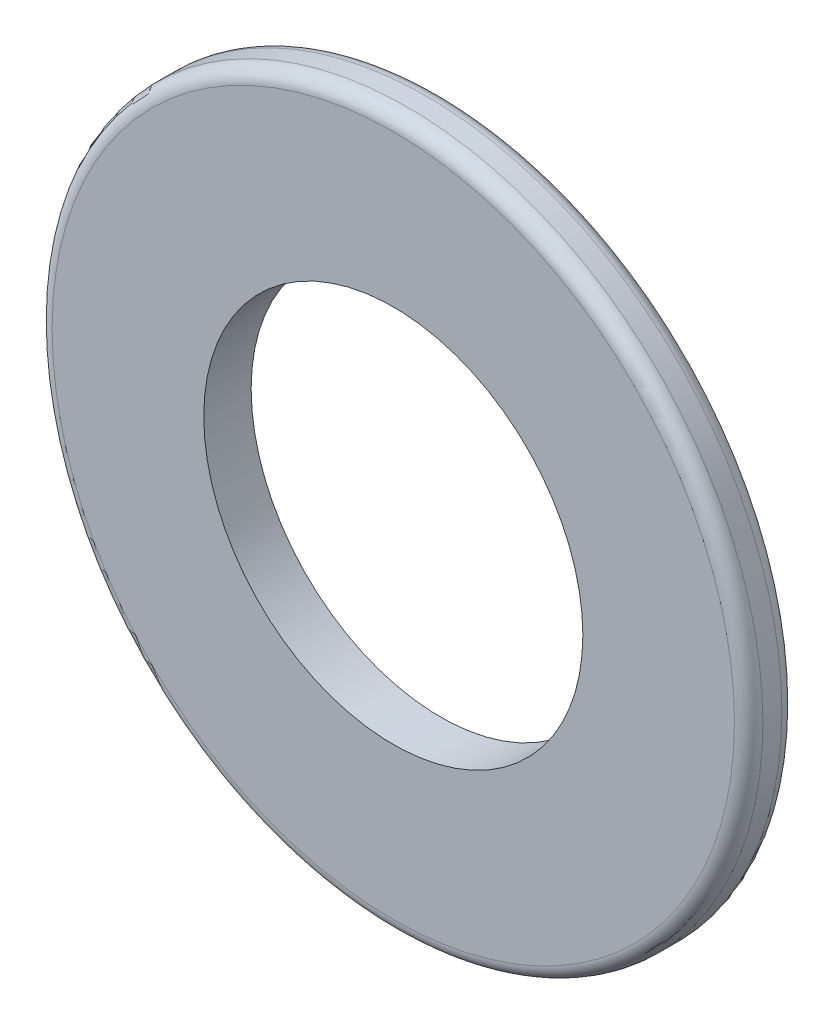
ISO-10303-21;
HEADER;
FILE_DESCRIPTION(('STEP AP214'),'2;1');
FILE_NAME('part.step','',(''),(''),'','','');
FILE_SCHEMA(('AUTOMOTIVE_DESIGN { 1 0 10303 214 1 1 1 1 }'));
ENDSEC;
DATA;
#1=APPLICATION_CONTEXT('core data for automotive mechanical design processes');
#2=APPLICATION_PROTOCOL_DEFINITION('international standard','automotive_design',2000,#1);
#3=PRODUCT_CONTEXT('',#1,'mechanical');
#4=PRODUCT('Part','Part','',(#3));
#5=PRODUCT_RELATED_PRODUCT_CATEGORY('part','',(#4));
#6=PRODUCT_DEFINITION_FORMATION('','',#4);
#7=PRODUCT_DEFINITION_CONTEXT('part definition',#1,'design');
#8=PRODUCT_DEFINITION('design','',#6,#7);
#9=PRODUCT_DEFINITION_SHAPE('','',#8);
#10=(LENGTH_UNIT() NAMED_UNIT(*) SI_UNIT(.MILLI.,.METRE.));
#11=(NAMED_UNIT(*) PLANE_ANGLE_UNIT() SI_UNIT($,.RADIAN.));
#12=(NAMED_UNIT(*) SI_UNIT($,.STERADIAN.) SOLID_ANGLE_UNIT());
#13=UNCERTAINTY_MEASURE_WITH_UNIT(LENGTH_MEASURE(1.E-05),#10,'distance_accuracy_value','');
#14=(GEOMETRIC_REPRESENTATION_CONTEXT(3) GLOBAL_UNCERTAINTY_ASSIGNED_CONTEXT((#13)) GLOBAL_UNIT_ASSIGNED_CONTEXT((#10,
#11,#12)) REPRESENTATION_CONTEXT('',''));
#15=CARTESIAN_POINT('',(0.,0.,0.));
#16=DIRECTION('',(0.,0.,1.));
#17=DIRECTION('',(1.,0.,0.));
#18=AXIS2_PLACEMENT_3D('',#15,#16,#17);
#19=CARTESIAN_POINT('',(0.,0.,1.));
#20=DIRECTION('',(0.,0.,1.));
#21=DIRECTION('',(1.,0.,0.));
#22=AXIS2_PLACEMENT_3D('',#19,#20,#21);
#23=PLANE('',#22);
#24=CARTESIAN_POINT('',(0.,0.,1.));
#25=DIRECTION('',(0.,0.,1.));
#26=DIRECTION('',(1.,0.,0.));
#27=AXIS2_PLACEMENT_3D('',#24,#25,#26);
#28=CIRCLE('',#27,7.2);
#29=CARTESIAN_POINT('',(7.2,0.,1.));
#30=VERTEX_POINT('',#29);
#31=EDGE_CURVE('E38',#30,#30,#28,.T.);
#32=ORIENTED_EDGE('',*,*,#31,.T.);
#33=EDGE_LOOP('',(#32));
#34=FACE_BOUND('',#33,.T.);
#35=CARTESIAN_POINT('',(0.,0.,1.));
#36=DIRECTION('',(0.,0.,1.));
#37=DIRECTION('',(1.,0.,0.));
#38=AXIS2_PLACEMENT_3D('',#35,#36,#37);
#39=CIRCLE('',#38,4.);
#40=CARTESIAN_POINT('',(4.,0.,1.));
#41=VERTEX_POINT('',#40);
#42=EDGE_CURVE('E51',#41,#41,#39,.T.);
#43=ORIENTED_EDGE('',*,*,#42,.F.);
#44=EDGE_LOOP('',(#43));
#45=FACE_BOUND('',#44,.T.);
#46=ADVANCED_FACE('F31',(#34,#45),#23,.T.);
#47=CARTESIAN_POINT('',(0.,0.,0.));
#48=DIRECTION('',(0.,0.,1.));
#49=DIRECTION('',(1.,0.,0.));
#50=AXIS2_PLACEMENT_3D('',#47,#48,#49);
#51=PLANE('',#50);
#52=CARTESIAN_POINT('',(0.,0.,0.));
#53=DIRECTION('',(0.,0.,1.));
#54=DIRECTION('',(1.,0.,0.));
#55=AXIS2_PLACEMENT_3D('',#52,#53,#54);
#56=CIRCLE('',#55,7.2);
#57=CARTESIAN_POINT('',(7.2,0.,0.));
#58=VERTEX_POINT('',#57);
#59=EDGE_CURVE('E42',#58,#58,#56,.F.);
#60=ORIENTED_EDGE('',*,*,#59,.T.);
#61=EDGE_LOOP('',(#60));
#62=FACE_BOUND('',#61,.T.);
#63=CARTESIAN_POINT('',(0.,0.,0.));
#64=DIRECTION('',(0.,0.,1.));
#65=DIRECTION('',(1.,0.,0.));
#66=AXIS2_PLACEMENT_3D('',#63,#64,#65);
#67=CIRCLE('',#66,4.);
#68=CARTESIAN_POINT('',(4.,0.,0.));
#69=VERTEX_POINT('',#68);
#70=EDGE_CURVE('E52',#69,#69,#67,.T.);
#71=ORIENTED_EDGE('',*,*,#70,.T.);
#72=EDGE_LOOP('',(#71));
#73=FACE_BOUND('',#72,.T.);
#74=ADVANCED_FACE('F62',(#62,#73),#51,.F.);
#75=CARTESIAN_POINT('',(0.,0.,1.));
#76=DIRECTION('',(0.,0.,-1.));
#77=DIRECTION('',(-1.,0.,0.));
#78=AXIS2_PLACEMENT_3D('',#75,#76,#77);
#79=CYLINDRICAL_SURFACE('',#78,7.5);
#80=CARTESIAN_POINT('',(0.,0.,0.7));
#81=DIRECTION('',(0.,0.,1.));
#82=DIRECTION('',(1.,0.,0.));
#83=AXIS2_PLACEMENT_3D('',#80,#81,#82);
#84=CIRCLE('',#83,7.5);
#85=CARTESIAN_POINT('',(7.5,0.,0.7));
#86=VERTEX_POINT('',#85);
#87=EDGE_CURVE('E10',#86,#86,#84,.F.);
#88=ORIENTED_EDGE('',*,*,#87,.T.);
#89=EDGE_LOOP('',(#88));
#90=FACE_BOUND('',#89,.T.);
#91=CARTESIAN_POINT('',(0.,0.,0.3));
#92=DIRECTION('',(0.,0.,1.));
#93=DIRECTION('',(1.,0.,0.));
#94=AXIS2_PLACEMENT_3D('',#91,#92,#93);
#95=CIRCLE('',#94,7.5);
#96=CARTESIAN_POINT('',(7.5,0.,0.3));
#97=VERTEX_POINT('',#96);
#98=EDGE_CURVE('E46',#97,#97,#95,.T.);
#99=ORIENTED_EDGE('',*,*,#98,.T.);
#100=EDGE_LOOP('',(#99));
#101=FACE_BOUND('',#100,.T.);
#102=ADVANCED_FACE('F67',(#90,#101),#79,.T.);
#103=CARTESIAN_POINT('',(0.,0.,1.));
#104=DIRECTION('',(0.,0.,-1.));
#105=DIRECTION('',(-1.,0.,0.));
#106=AXIS2_PLACEMENT_3D('',#103,#104,#105);
#107=CYLINDRICAL_SURFACE('',#106,4.);
#108=ORIENTED_EDGE('',*,*,#42,.T.);
#109=EDGE_LOOP('',(#108));
#110=FACE_BOUND('',#109,.T.);
#111=ORIENTED_EDGE('',*,*,#70,.F.);
#112=EDGE_LOOP('',(#111));
#113=FACE_BOUND('',#112,.T.);
#114=ADVANCED_FACE('F58',(#110,#113),#107,.F.);
#115=CARTESIAN_POINT('',(0.,0.,0.3));
#116=DIRECTION('',(0.,0.,1.));
#117=DIRECTION('',(1.,0.,0.));
#118=AXIS2_PLACEMENT_3D('',#115,#116,#117);
#119=TOROIDAL_SURFACE('',#118,7.2,0.3);
#120=ORIENTED_EDGE('',*,*,#59,.F.);
#121=EDGE_LOOP('',(#120));
#122=FACE_BOUND('',#121,.T.);
#123=ORIENTED_EDGE('',*,*,#98,.F.);
#124=EDGE_LOOP('',(#123));
#125=FACE_BOUND('',#124,.T.);
#126=ADVANCED_FACE('F73',(#122,#125),#119,.T.);
#127=CARTESIAN_POINT('',(0.,0.,0.7));
#128=DIRECTION('',(0.,0.,1.));
#129=DIRECTION('',(1.,0.,0.));
#130=AXIS2_PLACEMENT_3D('',#127,#128,#129);
#131=TOROIDAL_SURFACE('',#130,7.2,0.3);
#132=ORIENTED_EDGE('',*,*,#87,.F.);
#133=EDGE_LOOP('',(#132));
#134=FACE_BOUND('',#133,.T.);
#135=ORIENTED_EDGE('',*,*,#31,.F.);
#136=EDGE_LOOP('',(#135));
#137=FACE_BOUND('',#136,.T.);
#138=ADVANCED_FACE('F33',(#134,#137),#131,.T.);
#139=CLOSED_SHELL('',(#46,#74,#102,#114,#126,#138));
#140=MANIFOLD_SOLID_BREP('B2',#139);
#141=ADVANCED_BREP_SHAPE_REPRESENTATION('',(#18,#140),#14);
#142=SHAPE_DEFINITION_REPRESENTATION(#9,#141);
ENDSEC;
END-ISO-10303-21;
